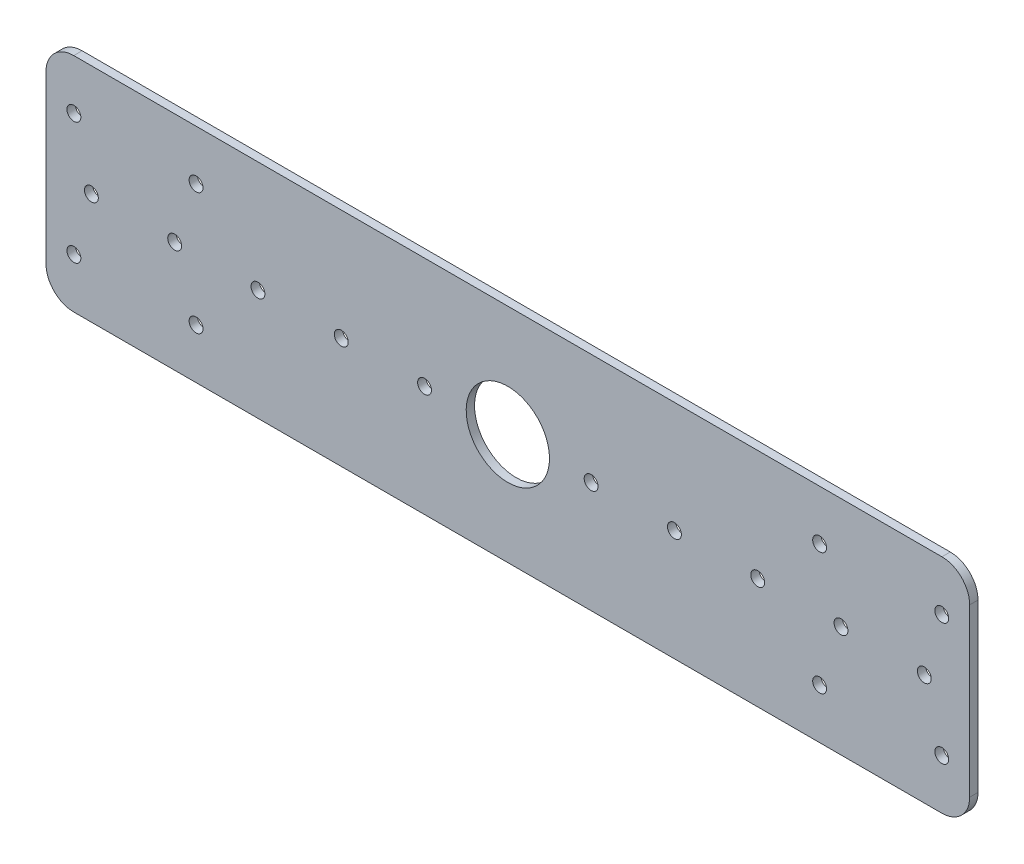
ISO-10303-21;
HEADER;
FILE_DESCRIPTION(('STEP AP214'),'2;1');
FILE_NAME('part.step','',(''),(''),'','','');
FILE_SCHEMA(('AUTOMOTIVE_DESIGN { 1 0 10303 214 1 1 1 1 }'));
ENDSEC;
DATA;
#1=APPLICATION_CONTEXT('core data for automotive mechanical design processes');
#2=APPLICATION_PROTOCOL_DEFINITION('international standard','automotive_design',2000,#1);
#3=PRODUCT_CONTEXT('',#1,'mechanical');
#4=PRODUCT('Part','Part','',(#3));
#5=PRODUCT_RELATED_PRODUCT_CATEGORY('part','',(#4));
#6=PRODUCT_DEFINITION_FORMATION('','',#4);
#7=PRODUCT_DEFINITION_CONTEXT('part definition',#1,'design');
#8=PRODUCT_DEFINITION('design','',#6,#7);
#9=PRODUCT_DEFINITION_SHAPE('','',#8);
#10=(LENGTH_UNIT() NAMED_UNIT(*) SI_UNIT(.MILLI.,.METRE.));
#11=(NAMED_UNIT(*) PLANE_ANGLE_UNIT() SI_UNIT($,.RADIAN.));
#12=(NAMED_UNIT(*) SI_UNIT($,.STERADIAN.) SOLID_ANGLE_UNIT());
#13=UNCERTAINTY_MEASURE_WITH_UNIT(LENGTH_MEASURE(1.E-05),#10,'distance_accuracy_value','');
#14=(GEOMETRIC_REPRESENTATION_CONTEXT(3) GLOBAL_UNCERTAINTY_ASSIGNED_CONTEXT((#13)) GLOBAL_UNIT_ASSIGNED_CONTEXT((#10,
#11,#12)) REPRESENTATION_CONTEXT('',''));
#15=CARTESIAN_POINT('',(0.,0.,0.));
#16=DIRECTION('',(0.,0.,1.));
#17=DIRECTION('',(1.,0.,0.));
#18=AXIS2_PLACEMENT_3D('',#15,#16,#17);
#19=CARTESIAN_POINT('',(83.8429399397533,-104.498537260053,2.9999972895472));
#20=DIRECTION('',(-1.,0.,0.));
#21=DIRECTION('',(0.,0.,1.));
#22=AXIS2_PLACEMENT_3D('',#19,#20,#21);
#23=PLANE('',#22);
#24=DIRECTION('',(0.,1.,2.59377104206923E-08));
#25=VECTOR('',#24,1.);
#26=CARTESIAN_POINT('',(83.8429399397533,-104.498537260053,2.9999972895472));
#27=LINE('',#26,#25);
#28=CARTESIAN_POINT('',(83.8429399397533,-169.998615709826,2.99999559062514));
#29=VERTEX_POINT('',#28);
#30=CARTESIAN_POINT('',(83.8429399397533,-109.998615709826,2.99999714688776));
#31=VERTEX_POINT('',#30);
#32=EDGE_CURVE('E140',#29,#31,#27,.T.);
#33=ORIENTED_EDGE('',*,*,#32,.F.);
#34=DIRECTION('',(0.,-2.59377104206923E-08,1.));
#35=VECTOR('',#34,1.);
#36=CARTESIAN_POINT('',(83.8429399397533,-169.998615632013,-4.40937486285395E-06));
#37=LINE('',#36,#35);
#38=CARTESIAN_POINT('',(83.8429399397533,-169.998615632013,-4.4093748641832E-06));
#39=VERTEX_POINT('',#38);
#40=EDGE_CURVE('E153',#29,#39,#37,.F.);
#41=ORIENTED_EDGE('',*,*,#40,.T.);
#42=DIRECTION('',(0.,1.,2.59377104206923E-08));
#43=VECTOR('',#42,1.);
#44=CARTESIAN_POINT('',(83.8429399397533,-104.49853718224,-2.71045279682035E-06));
#45=LINE('',#44,#43);
#46=CARTESIAN_POINT('',(83.8429399397533,-109.998615632013,-2.85311223894166E-06));
#47=VERTEX_POINT('',#46);
#48=EDGE_CURVE('E172',#39,#47,#45,.T.);
#49=ORIENTED_EDGE('',*,*,#48,.T.);
#50=DIRECTION('',(0.,-2.59377104206923E-08,1.));
#51=VECTOR('',#50,1.);
#52=CARTESIAN_POINT('',(83.8429399397533,-109.998615709826,2.99999714688776));
#53=LINE('',#52,#51);
#54=EDGE_CURVE('E150',#47,#31,#53,.T.);
#55=ORIENTED_EDGE('',*,*,#54,.T.);
#56=EDGE_LOOP('',(#33,#41,#49,#55));
#57=FACE_BOUND('',#56,.T.);
#58=ADVANCED_FACE('F45',(#57),#23,.F.);
#59=CARTESIAN_POINT('',(-248.842939940333,-104.498537260053,2.9999972895472));
#60=DIRECTION('',(1.,0.,0.));
#61=DIRECTION('',(0.,0.,-1.));
#62=AXIS2_PLACEMENT_3D('',#59,#60,#61);
#63=PLANE('',#62);
#64=DIRECTION('',(0.,-1.,-2.59377104206923E-08));
#65=VECTOR('',#64,1.);
#66=CARTESIAN_POINT('',(-248.842939940333,-104.49853718224,-2.7104527968145E-06));
#67=LINE('',#66,#65);
#68=CARTESIAN_POINT('',(-248.842939940333,-109.998615632013,-2.85311223893581E-06));
#69=VERTEX_POINT('',#68);
#70=CARTESIAN_POINT('',(-248.842939940333,-169.998615632013,-4.40937486417735E-06));
#71=VERTEX_POINT('',#70);
#72=EDGE_CURVE('E168',#69,#71,#67,.T.);
#73=ORIENTED_EDGE('',*,*,#72,.T.);
#74=DIRECTION('',(0.,-2.59377104206923E-08,1.));
#75=VECTOR('',#74,1.);
#76=CARTESIAN_POINT('',(-248.842939940333,-169.998615709826,2.99999559062514));
#77=LINE('',#76,#75);
#78=CARTESIAN_POINT('',(-248.842939940333,-169.998615709826,2.99999559062514));
#79=VERTEX_POINT('',#78);
#80=EDGE_CURVE('E11',#71,#79,#77,.T.);
#81=ORIENTED_EDGE('',*,*,#80,.T.);
#82=DIRECTION('',(0.,-1.,-2.59377104206923E-08));
#83=VECTOR('',#82,1.);
#84=CARTESIAN_POINT('',(-248.842939940333,-104.498537260053,2.9999972895472));
#85=LINE('',#84,#83);
#86=CARTESIAN_POINT('',(-248.842939940333,-109.998615709826,2.99999714688776));
#87=VERTEX_POINT('',#86);
#88=EDGE_CURVE('E117',#87,#79,#85,.T.);
#89=ORIENTED_EDGE('',*,*,#88,.F.);
#90=DIRECTION('',(0.,-2.59377104206923E-08,1.));
#91=VECTOR('',#90,1.);
#92=CARTESIAN_POINT('',(-248.842939940333,-109.998615709826,2.99999714688776));
#93=LINE('',#92,#91);
#94=EDGE_CURVE('E53',#87,#69,#93,.F.);
#95=ORIENTED_EDGE('',*,*,#94,.T.);
#96=EDGE_LOOP('',(#73,#81,#89,#95));
#97=FACE_BOUND('',#96,.T.);
#98=ADVANCED_FACE('F167',(#97),#63,.F.);
#99=CARTESIAN_POINT('',(0.,-7.78131312620769E-08,3.));
#100=DIRECTION('',(0.,-2.59377104206923E-08,1.));
#101=DIRECTION('',(0.,-1.,-2.59377104206923E-08));
#102=AXIS2_PLACEMENT_3D('',#99,#100,#101);
#103=PLANE('',#102);
#104=CARTESIAN_POINT('',(-232.50000000029,-139.998615709826,2.99999844377328));
#105=DIRECTION('',(0.,2.59377104206923E-08,-1.));
#106=DIRECTION('',(0.,1.,2.59377104206923E-08));
#107=AXIS2_PLACEMENT_3D('',#104,#105,#106);
#108=CIRCLE('',#107,2.5);
#109=CARTESIAN_POINT('',(-232.50000000029,-137.498615709826,2.99999850861756));
#110=VERTEX_POINT('',#109);
#111=EDGE_CURVE('E366',#110,#110,#108,.T.);
#112=ORIENTED_EDGE('',*,*,#111,.T.);
#113=EDGE_LOOP('',(#112));
#114=FACE_BOUND('',#113,.T.);
#115=CARTESIAN_POINT('',(67.49999999971,-139.998615709826,2.99999844377328));
#116=DIRECTION('',(0.,2.59377104206923E-08,-1.));
#117=DIRECTION('',(0.,1.,2.59377104206923E-08));
#118=AXIS2_PLACEMENT_3D('',#115,#116,#117);
#119=CIRCLE('',#118,2.5);
#120=CARTESIAN_POINT('',(67.49999999971,-137.498615709826,2.99999850861756));
#121=VERTEX_POINT('',#120);
#122=EDGE_CURVE('E370',#121,#121,#119,.T.);
#123=ORIENTED_EDGE('',*,*,#122,.T.);
#124=EDGE_LOOP('',(#123));
#125=FACE_BOUND('',#124,.T.);
#126=CARTESIAN_POINT('',(37.49999999971,-139.998615709826,2.99999844377328));
#127=DIRECTION('',(0.,2.59377104206923E-08,-1.));
#128=DIRECTION('',(0.,1.,2.59377104206923E-08));
#129=AXIS2_PLACEMENT_3D('',#126,#127,#128);
#130=CIRCLE('',#129,2.5);
#131=CARTESIAN_POINT('',(37.49999999971,-137.498615709826,2.99999850861756));
#132=VERTEX_POINT('',#131);
#133=EDGE_CURVE('E374',#132,#132,#130,.T.);
#134=ORIENTED_EDGE('',*,*,#133,.T.);
#135=EDGE_LOOP('',(#134));
#136=FACE_BOUND('',#135,.T.);
#137=CARTESIAN_POINT('',(7.49999999971002,-139.998615709826,2.99999844377328));
#138=DIRECTION('',(0.,2.59377104206923E-08,-1.));
#139=DIRECTION('',(0.,1.,2.59377104206923E-08));
#140=AXIS2_PLACEMENT_3D('',#137,#138,#139);
#141=CIRCLE('',#140,2.5);
#142=CARTESIAN_POINT('',(7.49999999971002,-137.498615709826,2.99999850861756));
#143=VERTEX_POINT('',#142);
#144=EDGE_CURVE('E378',#143,#143,#141,.T.);
#145=ORIENTED_EDGE('',*,*,#144,.T.);
#146=EDGE_LOOP('',(#145));
#147=FACE_BOUND('',#146,.T.);
#148=CARTESIAN_POINT('',(-22.50000000029,-139.998615709826,2.99999844377328));
#149=DIRECTION('',(0.,2.59377104206923E-08,-1.));
#150=DIRECTION('',(0.,1.,2.59377104206923E-08));
#151=AXIS2_PLACEMENT_3D('',#148,#149,#150);
#152=CIRCLE('',#151,2.5);
#153=CARTESIAN_POINT('',(-22.50000000029,-137.498615709826,2.99999850861756));
#154=VERTEX_POINT('',#153);
#155=EDGE_CURVE('E382',#154,#154,#152,.T.);
#156=ORIENTED_EDGE('',*,*,#155,.T.);
#157=EDGE_LOOP('',(#156));
#158=FACE_BOUND('',#157,.T.);
#159=CARTESIAN_POINT('',(-52.50000000029,-139.998615709826,2.99999844377328));
#160=DIRECTION('',(0.,2.59377104206923E-08,-1.));
#161=DIRECTION('',(0.,1.,2.59377104206923E-08));
#162=AXIS2_PLACEMENT_3D('',#159,#160,#161);
#163=CIRCLE('',#162,2.5);
#164=CARTESIAN_POINT('',(-52.50000000029,-137.498615709826,2.99999850861756));
#165=VERTEX_POINT('',#164);
#166=EDGE_CURVE('E386',#165,#165,#163,.T.);
#167=ORIENTED_EDGE('',*,*,#166,.T.);
#168=EDGE_LOOP('',(#167));
#169=FACE_BOUND('',#168,.T.);
#170=CARTESIAN_POINT('',(-112.50000000029,-139.998615709826,2.99999844377328));
#171=DIRECTION('',(0.,2.59377104206923E-08,-1.));
#172=DIRECTION('',(0.,1.,2.59377104206923E-08));
#173=AXIS2_PLACEMENT_3D('',#170,#171,#172);
#174=CIRCLE('',#173,2.5);
#175=CARTESIAN_POINT('',(-112.50000000029,-137.498615709826,2.99999850861756));
#176=VERTEX_POINT('',#175);
#177=EDGE_CURVE('E390',#176,#176,#174,.T.);
#178=ORIENTED_EDGE('',*,*,#177,.T.);
#179=EDGE_LOOP('',(#178));
#180=FACE_BOUND('',#179,.T.);
#181=CARTESIAN_POINT('',(-142.50000000029,-139.998615709826,2.99999844377328));
#182=DIRECTION('',(0.,2.59377104206923E-08,-1.));
#183=DIRECTION('',(0.,1.,2.59377104206923E-08));
#184=AXIS2_PLACEMENT_3D('',#181,#182,#183);
#185=CIRCLE('',#184,2.5);
#186=CARTESIAN_POINT('',(-142.50000000029,-137.498615709826,2.99999850861756));
#187=VERTEX_POINT('',#186);
#188=EDGE_CURVE('E394',#187,#187,#185,.T.);
#189=ORIENTED_EDGE('',*,*,#188,.T.);
#190=EDGE_LOOP('',(#189));
#191=FACE_BOUND('',#190,.T.);
#192=CARTESIAN_POINT('',(-172.50000000029,-139.998615709826,2.99999844377328));
#193=DIRECTION('',(0.,2.59377104206923E-08,-1.));
#194=DIRECTION('',(0.,1.,2.59377104206923E-08));
#195=AXIS2_PLACEMENT_3D('',#192,#193,#194);
#196=CIRCLE('',#195,2.5);
#197=CARTESIAN_POINT('',(-172.50000000029,-137.498615709826,2.99999850861756));
#198=VERTEX_POINT('',#197);
#199=EDGE_CURVE('E398',#198,#198,#196,.T.);
#200=ORIENTED_EDGE('',*,*,#199,.T.);
#201=EDGE_LOOP('',(#200));
#202=FACE_BOUND('',#201,.T.);
#203=CARTESIAN_POINT('',(-202.50000000029,-139.998615709826,2.99999844377328));
#204=DIRECTION('',(0.,2.59377104206923E-08,-1.));
#205=DIRECTION('',(0.,1.,2.59377104206923E-08));
#206=AXIS2_PLACEMENT_3D('',#203,#204,#205);
#207=CIRCLE('',#206,2.5);
#208=CARTESIAN_POINT('',(-202.50000000029,-137.498615709826,2.99999850861756));
#209=VERTEX_POINT('',#208);
#210=EDGE_CURVE('E133',#209,#209,#207,.T.);
#211=ORIENTED_EDGE('',*,*,#210,.T.);
#212=EDGE_LOOP('',(#211));
#213=FACE_BOUND('',#212,.T.);
#214=CARTESIAN_POINT('',(73.7999979399371,-161.998615709887,2.99999579812682));
#215=DIRECTION('',(0.,-2.59377104206923E-08,1.));
#216=DIRECTION('',(0.,-1.,-2.59377104206923E-08));
#217=AXIS2_PLACEMENT_3D('',#214,#215,#216);
#218=CIRCLE('',#217,2.5);
#219=CARTESIAN_POINT('',(73.7999979399371,-164.498615709887,2.99999573328254));
#220=VERTEX_POINT('',#219);
#221=EDGE_CURVE('E228',#220,#220,#218,.T.);
#222=ORIENTED_EDGE('',*,*,#221,.F.);
#223=EDGE_LOOP('',(#222));
#224=FACE_BOUND('',#223,.T.);
#225=CARTESIAN_POINT('',(-238.799997940517,-161.998615709887,2.99999579812682));
#226=DIRECTION('',(0.,-2.59377104206923E-08,1.));
#227=DIRECTION('',(0.,-1.,-2.59377104206923E-08));
#228=AXIS2_PLACEMENT_3D('',#225,#226,#227);
#229=CIRCLE('',#228,2.5);
#230=CARTESIAN_POINT('',(-238.799997940517,-164.498615709887,2.99999573328254));
#231=VERTEX_POINT('',#230);
#232=EDGE_CURVE('E225',#231,#231,#229,.T.);
#233=ORIENTED_EDGE('',*,*,#232,.F.);
#234=EDGE_LOOP('',(#233));
#235=FACE_BOUND('',#234,.T.);
#236=CARTESIAN_POINT('',(-194.799997940493,-161.998615709887,2.99999579812682));
#237=DIRECTION('',(0.,-2.59377104206923E-08,1.));
#238=DIRECTION('',(0.,-1.,-2.59377104206923E-08));
#239=AXIS2_PLACEMENT_3D('',#236,#237,#238);
#240=CIRCLE('',#239,2.5);
#241=CARTESIAN_POINT('',(-194.799997940493,-164.498615709887,2.99999573328254));
#242=VERTEX_POINT('',#241);
#243=EDGE_CURVE('E222',#242,#242,#240,.T.);
#244=ORIENTED_EDGE('',*,*,#243,.F.);
#245=EDGE_LOOP('',(#244));
#246=FACE_BOUND('',#245,.T.);
#247=CARTESIAN_POINT('',(-194.799997940517,-117.998615709887,2.99999693938608));
#248=DIRECTION('',(0.,-2.59377104206923E-08,1.));
#249=DIRECTION('',(0.,-1.,-2.59377104206923E-08));
#250=AXIS2_PLACEMENT_3D('',#247,#248,#249);
#251=CIRCLE('',#250,2.5);
#252=CARTESIAN_POINT('',(-194.799997940517,-120.498615709887,2.9999968745418));
#253=VERTEX_POINT('',#252);
#254=EDGE_CURVE('E219',#253,#253,#251,.T.);
#255=ORIENTED_EDGE('',*,*,#254,.F.);
#256=EDGE_LOOP('',(#255));
#257=FACE_BOUND('',#256,.T.);
#258=CARTESIAN_POINT('',(29.7999979399133,-161.998615709887,2.99999579812682));
#259=DIRECTION('',(0.,-2.59377104206923E-08,1.));
#260=DIRECTION('',(0.,-1.,-2.59377104206923E-08));
#261=AXIS2_PLACEMENT_3D('',#258,#259,#260);
#262=CIRCLE('',#261,2.5);
#263=CARTESIAN_POINT('',(29.7999979399133,-164.498615709887,2.99999573328254));
#264=VERTEX_POINT('',#263);
#265=EDGE_CURVE('E216',#264,#264,#262,.T.);
#266=ORIENTED_EDGE('',*,*,#265,.F.);
#267=EDGE_LOOP('',(#266));
#268=FACE_BOUND('',#267,.T.);
#269=CARTESIAN_POINT('',(29.799997939937,-117.998615709887,2.99999693938608));
#270=DIRECTION('',(0.,-2.59377104206923E-08,1.));
#271=DIRECTION('',(0.,-1.,-2.59377104206923E-08));
#272=AXIS2_PLACEMENT_3D('',#269,#270,#271);
#273=CIRCLE('',#272,2.5);
#274=CARTESIAN_POINT('',(29.799997939937,-120.498615709887,2.9999968745418));
#275=VERTEX_POINT('',#274);
#276=EDGE_CURVE('E213',#275,#275,#273,.T.);
#277=ORIENTED_EDGE('',*,*,#276,.F.);
#278=EDGE_LOOP('',(#277));
#279=FACE_BOUND('',#278,.T.);
#280=CARTESIAN_POINT('',(73.799997939937,-117.998615709911,2.99999693938608));
#281=DIRECTION('',(0.,-2.59377104206923E-08,1.));
#282=DIRECTION('',(0.,-1.,-2.59377104206923E-08));
#283=AXIS2_PLACEMENT_3D('',#280,#281,#282);
#284=CIRCLE('',#283,2.50000000000003);
#285=CARTESIAN_POINT('',(73.799997939937,-120.498615709911,2.9999968745418));
#286=VERTEX_POINT('',#285);
#287=EDGE_CURVE('E210',#286,#286,#284,.T.);
#288=ORIENTED_EDGE('',*,*,#287,.F.);
#289=EDGE_LOOP('',(#288));
#290=FACE_BOUND('',#289,.T.);
#291=CARTESIAN_POINT('',(-238.799997940517,-117.998615709911,2.99999693938608));
#292=DIRECTION('',(0.,-2.59377104206923E-08,1.));
#293=DIRECTION('',(0.,-1.,-2.59377104206923E-08));
#294=AXIS2_PLACEMENT_3D('',#291,#292,#293);
#295=CIRCLE('',#294,2.50000000000002);
#296=CARTESIAN_POINT('',(-238.799997940517,-120.498615709911,2.9999968745418));
#297=VERTEX_POINT('',#296);
#298=EDGE_CURVE('E207',#297,#297,#295,.T.);
#299=ORIENTED_EDGE('',*,*,#298,.F.);
#300=EDGE_LOOP('',(#299));
#301=FACE_BOUND('',#300,.T.);
#302=CARTESIAN_POINT('',(-82.50000000029,-139.998615709826,2.99999636875645));
#303=DIRECTION('',(0.,-2.59377104206923E-08,1.));
#304=DIRECTION('',(0.,-1.,-2.59377104206923E-08));
#305=AXIS2_PLACEMENT_3D('',#302,#303,#304);
#306=CIRCLE('',#305,15.);
#307=CARTESIAN_POINT('',(-82.50000000029,-154.998615709826,2.99999597969079));
#308=VERTEX_POINT('',#307);
#309=EDGE_CURVE('E231',#308,#308,#306,.T.);
#310=ORIENTED_EDGE('',*,*,#309,.F.);
#311=EDGE_LOOP('',(#310));
#312=FACE_BOUND('',#311,.T.);
#313=DIRECTION('',(1.,0.,0.));
#314=VECTOR('',#313,1.);
#315=CARTESIAN_POINT('',(0.,-179.998615709826,2.99999533124803));
#316=LINE('',#315,#314);
#317=CARTESIAN_POINT('',(-238.842939940333,-179.998615709826,2.99999533124803));
#318=VERTEX_POINT('',#317);
#319=CARTESIAN_POINT('',(73.8429399397533,-179.998615709826,2.99999533124803));
#320=VERTEX_POINT('',#319);
#321=EDGE_CURVE('E115',#318,#320,#316,.T.);
#322=ORIENTED_EDGE('',*,*,#321,.T.);
#323=CARTESIAN_POINT('',(73.8429399397533,-169.998615709826,2.99999559062514));
#324=DIRECTION('',(0.,-2.59377104206923E-08,1.));
#325=DIRECTION('',(0.,-1.,-2.59377104206923E-08));
#326=AXIS2_PLACEMENT_3D('',#323,#324,#325);
#327=CIRCLE('',#326,10.);
#328=EDGE_CURVE('E148',#320,#29,#327,.T.);
#329=ORIENTED_EDGE('',*,*,#328,.T.);
#330=ORIENTED_EDGE('',*,*,#32,.T.);
#331=CARTESIAN_POINT('',(73.8429399397533,-109.998615709826,2.99999714688776));
#332=DIRECTION('',(0.,-2.59377104206923E-08,1.));
#333=DIRECTION('',(0.,-1.,-2.59377104206923E-08));
#334=AXIS2_PLACEMENT_3D('',#331,#332,#333);
#335=CIRCLE('',#334,10.);
#336=CARTESIAN_POINT('',(73.8429399397533,-99.998615709826,2.99999740626487));
#337=VERTEX_POINT('',#336);
#338=EDGE_CURVE('E121',#31,#337,#335,.T.);
#339=ORIENTED_EDGE('',*,*,#338,.T.);
#340=DIRECTION('',(1.,0.,0.));
#341=VECTOR('',#340,1.);
#342=CARTESIAN_POINT('',(0.,-99.998615709826,2.99999740626487));
#343=LINE('',#342,#341);
#344=CARTESIAN_POINT('',(-238.842939940333,-99.998615709826,2.99999740626487));
#345=VERTEX_POINT('',#344);
#346=EDGE_CURVE('E176',#345,#337,#343,.T.);
#347=ORIENTED_EDGE('',*,*,#346,.F.);
#348=CARTESIAN_POINT('',(-238.842939940333,-109.998615709826,2.99999714688776));
#349=DIRECTION('',(0.,-2.59377104206923E-08,1.));
#350=DIRECTION('',(0.,-1.,-2.59377104206923E-08));
#351=AXIS2_PLACEMENT_3D('',#348,#349,#350);
#352=CIRCLE('',#351,10.);
#353=EDGE_CURVE('E122',#345,#87,#352,.T.);
#354=ORIENTED_EDGE('',*,*,#353,.T.);
#355=ORIENTED_EDGE('',*,*,#88,.T.);
#356=CARTESIAN_POINT('',(-238.842939940333,-169.998615709826,2.99999559062513));
#357=DIRECTION('',(0.,-2.59377104206923E-08,1.));
#358=DIRECTION('',(0.,-1.,-2.59377104206923E-08));
#359=AXIS2_PLACEMENT_3D('',#356,#357,#358);
#360=CIRCLE('',#359,10.);
#361=EDGE_CURVE('E112',#79,#318,#360,.T.);
#362=ORIENTED_EDGE('',*,*,#361,.T.);
#363=EDGE_LOOP('',(#322,#329,#330,#339,#347,#354,#355,#362));
#364=FACE_BOUND('',#363,.T.);
#365=ADVANCED_FACE('F114',(#114,#125,#136,#147,#158,#169,#180,#191,#202,#213,#224,#235,#246,
#257,#268,#279,#290,#301,#312,#364),#103,.T.);
#366=CARTESIAN_POINT('',(0.,0.,0.));
#367=DIRECTION('',(0.,-2.59377104206923E-08,1.));
#368=DIRECTION('',(0.,-1.,-2.59377104206923E-08));
#369=AXIS2_PLACEMENT_3D('',#366,#367,#368);
#370=PLANE('',#369);
#371=CARTESIAN_POINT('',(-232.50000000029,-139.998615632013,-3.63124355155687E-06));
#372=DIRECTION('',(0.,2.59377104206923E-08,-1.));
#373=DIRECTION('',(0.,1.,2.59377104206923E-08));
#374=AXIS2_PLACEMENT_3D('',#371,#372,#373);
#375=CIRCLE('',#374,2.5);
#376=CARTESIAN_POINT('',(-232.50000000029,-137.498615632013,-3.56639927550514E-06));
#377=VERTEX_POINT('',#376);
#378=EDGE_CURVE('E417',#377,#377,#375,.T.);
#379=ORIENTED_EDGE('',*,*,#378,.F.);
#380=EDGE_LOOP('',(#379));
#381=FACE_BOUND('',#380,.T.);
#382=CARTESIAN_POINT('',(67.49999999971,-139.998615632013,-3.6312435515618E-06));
#383=DIRECTION('',(0.,2.59377104206923E-08,-1.));
#384=DIRECTION('',(0.,1.,2.59377104206923E-08));
#385=AXIS2_PLACEMENT_3D('',#382,#383,#384);
#386=CIRCLE('',#385,2.5);
#387=CARTESIAN_POINT('',(67.49999999971,-137.498615632013,-3.56639927551007E-06));
#388=VERTEX_POINT('',#387);
#389=EDGE_CURVE('E421',#388,#388,#386,.T.);
#390=ORIENTED_EDGE('',*,*,#389,.F.);
#391=EDGE_LOOP('',(#390));
#392=FACE_BOUND('',#391,.T.);
#393=CARTESIAN_POINT('',(37.49999999971,-139.998615632013,-3.6312435515618E-06));
#394=DIRECTION('',(0.,2.59377104206923E-08,-1.));
#395=DIRECTION('',(0.,1.,2.59377104206923E-08));
#396=AXIS2_PLACEMENT_3D('',#393,#394,#395);
#397=CIRCLE('',#396,2.5);
#398=CARTESIAN_POINT('',(37.49999999971,-137.498615632013,-3.56639927551007E-06));
#399=VERTEX_POINT('',#398);
#400=EDGE_CURVE('E425',#399,#399,#397,.T.);
#401=ORIENTED_EDGE('',*,*,#400,.F.);
#402=EDGE_LOOP('',(#401));
#403=FACE_BOUND('',#402,.T.);
#404=CARTESIAN_POINT('',(7.49999999971002,-139.998615632013,-3.6312435515618E-06));
#405=DIRECTION('',(0.,2.59377104206923E-08,-1.));
#406=DIRECTION('',(0.,1.,2.59377104206923E-08));
#407=AXIS2_PLACEMENT_3D('',#404,#405,#406);
#408=CIRCLE('',#407,2.5);
#409=CARTESIAN_POINT('',(7.49999999971002,-137.498615632013,-3.56639927551007E-06));
#410=VERTEX_POINT('',#409);
#411=EDGE_CURVE('E429',#410,#410,#408,.T.);
#412=ORIENTED_EDGE('',*,*,#411,.F.);
#413=EDGE_LOOP('',(#412));
#414=FACE_BOUND('',#413,.T.);
#415=CARTESIAN_POINT('',(-22.50000000029,-139.998615632013,-3.63124355156011E-06));
#416=DIRECTION('',(0.,2.59377104206923E-08,-1.));
#417=DIRECTION('',(0.,1.,2.59377104206923E-08));
#418=AXIS2_PLACEMENT_3D('',#415,#416,#417);
#419=CIRCLE('',#418,2.5);
#420=CARTESIAN_POINT('',(-22.50000000029,-137.498615632013,-3.56639927550838E-06));
#421=VERTEX_POINT('',#420);
#422=EDGE_CURVE('E433',#421,#421,#419,.T.);
#423=ORIENTED_EDGE('',*,*,#422,.F.);
#424=EDGE_LOOP('',(#423));
#425=FACE_BOUND('',#424,.T.);
#426=CARTESIAN_POINT('',(-52.50000000029,-139.998615632013,-3.63124355156011E-06));
#427=DIRECTION('',(0.,2.59377104206923E-08,-1.));
#428=DIRECTION('',(0.,1.,2.59377104206923E-08));
#429=AXIS2_PLACEMENT_3D('',#426,#427,#428);
#430=CIRCLE('',#429,2.5);
#431=CARTESIAN_POINT('',(-52.50000000029,-137.498615632013,-3.56639927550838E-06));
#432=VERTEX_POINT('',#431);
#433=EDGE_CURVE('E437',#432,#432,#430,.T.);
#434=ORIENTED_EDGE('',*,*,#433,.F.);
#435=EDGE_LOOP('',(#434));
#436=FACE_BOUND('',#435,.T.);
#437=CARTESIAN_POINT('',(-112.50000000029,-139.998615632013,-3.63124355155842E-06));
#438=DIRECTION('',(0.,2.59377104206923E-08,-1.));
#439=DIRECTION('',(0.,1.,2.59377104206923E-08));
#440=AXIS2_PLACEMENT_3D('',#437,#438,#439);
#441=CIRCLE('',#440,2.5);
#442=CARTESIAN_POINT('',(-112.50000000029,-137.498615632013,-3.56639927550669E-06));
#443=VERTEX_POINT('',#442);
#444=EDGE_CURVE('E441',#443,#443,#441,.T.);
#445=ORIENTED_EDGE('',*,*,#444,.F.);
#446=EDGE_LOOP('',(#445));
#447=FACE_BOUND('',#446,.T.);
#448=CARTESIAN_POINT('',(-142.50000000029,-139.998615632013,-3.63124355155842E-06));
#449=DIRECTION('',(0.,2.59377104206923E-08,-1.));
#450=DIRECTION('',(0.,1.,2.59377104206923E-08));
#451=AXIS2_PLACEMENT_3D('',#448,#449,#450);
#452=CIRCLE('',#451,2.5);
#453=CARTESIAN_POINT('',(-142.50000000029,-137.498615632013,-3.56639927550669E-06));
#454=VERTEX_POINT('',#453);
#455=EDGE_CURVE('E445',#454,#454,#452,.T.);
#456=ORIENTED_EDGE('',*,*,#455,.F.);
#457=EDGE_LOOP('',(#456));
#458=FACE_BOUND('',#457,.T.);
#459=CARTESIAN_POINT('',(-172.50000000029,-139.998615632013,-3.63124355155842E-06));
#460=DIRECTION('',(0.,2.59377104206923E-08,-1.));
#461=DIRECTION('',(0.,1.,2.59377104206923E-08));
#462=AXIS2_PLACEMENT_3D('',#459,#460,#461);
#463=CIRCLE('',#462,2.5);
#464=CARTESIAN_POINT('',(-172.50000000029,-137.498615632013,-3.56639927550669E-06));
#465=VERTEX_POINT('',#464);
#466=EDGE_CURVE('E413',#465,#465,#463,.T.);
#467=ORIENTED_EDGE('',*,*,#466,.F.);
#468=EDGE_LOOP('',(#467));
#469=FACE_BOUND('',#468,.T.);
#470=CARTESIAN_POINT('',(-202.50000000029,-139.998615632013,-3.63124355155672E-06));
#471=DIRECTION('',(0.,2.59377104206923E-08,-1.));
#472=DIRECTION('',(0.,1.,2.59377104206923E-08));
#473=AXIS2_PLACEMENT_3D('',#470,#471,#472);
#474=CIRCLE('',#473,2.5);
#475=CARTESIAN_POINT('',(-202.50000000029,-137.498615632013,-3.56639927550499E-06));
#476=VERTEX_POINT('',#475);
#477=EDGE_CURVE('E410',#476,#476,#474,.T.);
#478=ORIENTED_EDGE('',*,*,#477,.F.);
#479=EDGE_LOOP('',(#478));
#480=FACE_BOUND('',#479,.T.);
#481=CARTESIAN_POINT('',(73.7999979399371,-161.998615632074,-4.20187318081906E-06));
#482=DIRECTION('',(0.,2.59377104206923E-08,-1.));
#483=DIRECTION('',(0.,-1.,-2.59377104206923E-08));
#484=AXIS2_PLACEMENT_3D('',#481,#482,#483);
#485=CIRCLE('',#484,2.5);
#486=CARTESIAN_POINT('',(73.7999979399371,-164.498615632074,-4.26671745687079E-06));
#487=VERTEX_POINT('',#486);
#488=EDGE_CURVE('E187',#487,#487,#485,.T.);
#489=ORIENTED_EDGE('',*,*,#488,.F.);
#490=EDGE_LOOP('',(#489));
#491=FACE_BOUND('',#490,.T.);
#492=CARTESIAN_POINT('',(-238.799997940517,-161.998615632074,-4.20187318081357E-06));
#493=DIRECTION('',(0.,2.59377104206923E-08,-1.));
#494=DIRECTION('',(0.,1.,2.59377104206923E-08));
#495=AXIS2_PLACEMENT_3D('',#492,#493,#494);
#496=CIRCLE('',#495,2.5);
#497=CARTESIAN_POINT('',(-238.799997940517,-159.498615632074,-4.13702890476184E-06));
#498=VERTEX_POINT('',#497);
#499=EDGE_CURVE('E193',#498,#498,#496,.T.);
#500=ORIENTED_EDGE('',*,*,#499,.F.);
#501=EDGE_LOOP('',(#500));
#502=FACE_BOUND('',#501,.T.);
#503=CARTESIAN_POINT('',(-194.799997940493,-161.998615632074,-4.20187318081434E-06));
#504=DIRECTION('',(0.,2.59377104206923E-08,-1.));
#505=DIRECTION('',(0.,1.,2.59377104206923E-08));
#506=AXIS2_PLACEMENT_3D('',#503,#504,#505);
#507=CIRCLE('',#506,2.5);
#508=CARTESIAN_POINT('',(-194.799997940493,-159.498615632074,-4.13702890476261E-06));
#509=VERTEX_POINT('',#508);
#510=EDGE_CURVE('E196',#509,#509,#507,.T.);
#511=ORIENTED_EDGE('',*,*,#510,.F.);
#512=EDGE_LOOP('',(#511));
#513=FACE_BOUND('',#512,.T.);
#514=CARTESIAN_POINT('',(-194.799997940517,-117.998615632074,-3.06061392230388E-06));
#515=DIRECTION('',(0.,2.59377104206923E-08,-1.));
#516=DIRECTION('',(0.,1.,2.59377104206923E-08));
#517=AXIS2_PLACEMENT_3D('',#514,#515,#516);
#518=CIRCLE('',#517,2.5);
#519=CARTESIAN_POINT('',(-194.799997940517,-115.498615632074,-2.99576964625215E-06));
#520=VERTEX_POINT('',#519);
#521=EDGE_CURVE('E199',#520,#520,#518,.T.);
#522=ORIENTED_EDGE('',*,*,#521,.F.);
#523=EDGE_LOOP('',(#522));
#524=FACE_BOUND('',#523,.T.);
#525=CARTESIAN_POINT('',(29.7999979399133,-161.998615632074,-4.20187318081829E-06));
#526=DIRECTION('',(0.,2.59377104206923E-08,-1.));
#527=DIRECTION('',(0.,-1.,-2.59377104206923E-08));
#528=AXIS2_PLACEMENT_3D('',#525,#526,#527);
#529=CIRCLE('',#528,2.5);
#530=CARTESIAN_POINT('',(29.7999979399133,-164.498615632074,-4.26671745687002E-06));
#531=VERTEX_POINT('',#530);
#532=EDGE_CURVE('E184',#531,#531,#529,.T.);
#533=ORIENTED_EDGE('',*,*,#532,.F.);
#534=EDGE_LOOP('',(#533));
#535=FACE_BOUND('',#534,.T.);
#536=CARTESIAN_POINT('',(29.799997939937,-117.998615632074,-3.06061392230783E-06));
#537=DIRECTION('',(0.,2.59377104206923E-08,-1.));
#538=DIRECTION('',(0.,-1.,-2.59377104206923E-08));
#539=AXIS2_PLACEMENT_3D('',#536,#537,#538);
#540=CIRCLE('',#539,2.5);
#541=CARTESIAN_POINT('',(29.799997939937,-120.498615632074,-3.12545819835956E-06));
#542=VERTEX_POINT('',#541);
#543=EDGE_CURVE('E188',#542,#542,#540,.T.);
#544=ORIENTED_EDGE('',*,*,#543,.F.);
#545=EDGE_LOOP('',(#544));
#546=FACE_BOUND('',#545,.T.);
#547=CARTESIAN_POINT('',(73.799997939937,-117.998615632097,-3.06061392230922E-06));
#548=DIRECTION('',(0.,2.59377104206923E-08,-1.));
#549=DIRECTION('',(0.,-1.,-2.59377104206923E-08));
#550=AXIS2_PLACEMENT_3D('',#547,#548,#549);
#551=CIRCLE('',#550,2.50000000000003);
#552=CARTESIAN_POINT('',(73.799997939937,-120.498615632097,-3.12545819836095E-06));
#553=VERTEX_POINT('',#552);
#554=EDGE_CURVE('E180',#553,#553,#551,.T.);
#555=ORIENTED_EDGE('',*,*,#554,.F.);
#556=EDGE_LOOP('',(#555));
#557=FACE_BOUND('',#556,.T.);
#558=CARTESIAN_POINT('',(-238.799997940517,-117.998615632098,-3.06061392230373E-06));
#559=DIRECTION('',(0.,2.59377104206923E-08,-1.));
#560=DIRECTION('',(0.,1.,2.59377104206923E-08));
#561=AXIS2_PLACEMENT_3D('',#558,#559,#560);
#562=CIRCLE('',#561,2.50000000000002);
#563=CARTESIAN_POINT('',(-238.799997940517,-115.498615632098,-2.995769646252E-06));
#564=VERTEX_POINT('',#563);
#565=EDGE_CURVE('E202',#564,#564,#562,.T.);
#566=ORIENTED_EDGE('',*,*,#565,.F.);
#567=EDGE_LOOP('',(#566));
#568=FACE_BOUND('',#567,.T.);
#569=CARTESIAN_POINT('',(-82.50000000029,-139.998615632013,-3.63124355237665E-06));
#570=DIRECTION('',(0.,-2.59377104206923E-08,1.));
#571=DIRECTION('',(0.,-1.,-2.59377104206923E-08));
#572=AXIS2_PLACEMENT_3D('',#569,#570,#571);
#573=CIRCLE('',#572,15.);
#574=CARTESIAN_POINT('',(-82.50000000029,-154.998615632013,-4.02030920868704E-06));
#575=VERTEX_POINT('',#574);
#576=EDGE_CURVE('E143',#575,#575,#573,.T.);
#577=ORIENTED_EDGE('',*,*,#576,.T.);
#578=EDGE_LOOP('',(#577));
#579=FACE_BOUND('',#578,.T.);
#580=ORIENTED_EDGE('',*,*,#48,.F.);
#581=CARTESIAN_POINT('',(73.8429399397533,-169.998615632013,-4.40937486418303E-06));
#582=DIRECTION('',(0.,-2.59377104206923E-08,1.));
#583=DIRECTION('',(0.,-1.,-2.59377104206923E-08));
#584=AXIS2_PLACEMENT_3D('',#581,#582,#583);
#585=CIRCLE('',#584,10.);
#586=CARTESIAN_POINT('',(73.8429399397533,-179.998615632013,-4.66875196706087E-06));
#587=VERTEX_POINT('',#586);
#588=EDGE_CURVE('E159',#39,#587,#585,.F.);
#589=ORIENTED_EDGE('',*,*,#588,.T.);
#590=DIRECTION('',(1.,0.,0.));
#591=VECTOR('',#590,1.);
#592=CARTESIAN_POINT('',(0.,-179.998615632013,-4.66875196706087E-06));
#593=LINE('',#592,#591);
#594=CARTESIAN_POINT('',(-238.842939940333,-179.998615632013,-4.66875196706087E-06));
#595=VERTEX_POINT('',#594);
#596=EDGE_CURVE('E132',#595,#587,#593,.T.);
#597=ORIENTED_EDGE('',*,*,#596,.F.);
#598=CARTESIAN_POINT('',(-238.842939940333,-169.998615632013,-4.4093748643656E-06));
#599=DIRECTION('',(0.,-2.59377104206923E-08,1.));
#600=DIRECTION('',(0.,-1.,-2.59377104206923E-08));
#601=AXIS2_PLACEMENT_3D('',#598,#599,#600);
#602=CIRCLE('',#601,10.);
#603=EDGE_CURVE('E137',#595,#71,#602,.F.);
#604=ORIENTED_EDGE('',*,*,#603,.T.);
#605=ORIENTED_EDGE('',*,*,#72,.F.);
#606=CARTESIAN_POINT('',(-238.842939940333,-109.998615632013,-2.85311223893599E-06));
#607=DIRECTION('',(0.,-2.59377104206923E-08,1.));
#608=DIRECTION('',(0.,-1.,-2.59377104206923E-08));
#609=AXIS2_PLACEMENT_3D('',#606,#607,#608);
#610=CIRCLE('',#609,10.);
#611=CARTESIAN_POINT('',(-238.842939940333,-99.9986156320129,-2.59373513335562E-06));
#612=VERTEX_POINT('',#611);
#613=EDGE_CURVE('E67',#69,#612,#610,.F.);
#614=ORIENTED_EDGE('',*,*,#613,.T.);
#615=DIRECTION('',(1.,0.,0.));
#616=VECTOR('',#615,1.);
#617=CARTESIAN_POINT('',(0.,-99.9986156320129,-2.59373513335562E-06));
#618=LINE('',#617,#616);
#619=CARTESIAN_POINT('',(73.8429399397533,-99.9986156320129,-2.59373513335562E-06));
#620=VERTEX_POINT('',#619);
#621=EDGE_CURVE('E177',#612,#620,#618,.T.);
#622=ORIENTED_EDGE('',*,*,#621,.T.);
#623=CARTESIAN_POINT('',(73.8429399397533,-109.998615632013,-2.85311223908666E-06));
#624=DIRECTION('',(0.,-2.59377104206923E-08,1.));
#625=DIRECTION('',(0.,-1.,-2.59377104206923E-08));
#626=AXIS2_PLACEMENT_3D('',#623,#624,#625);
#627=CIRCLE('',#626,10.);
#628=EDGE_CURVE('E157',#620,#47,#627,.F.);
#629=ORIENTED_EDGE('',*,*,#628,.T.);
#630=EDGE_LOOP('',(#580,#589,#597,#604,#605,#614,#622,#629));
#631=FACE_BOUND('',#630,.T.);
#632=ADVANCED_FACE('F171',(#381,#392,#403,#414,#425,#436,#447,#458,#469,#480,#491,#502,#513,
#524,#535,#546,#557,#568,#579,#631),#370,.F.);
#633=CARTESIAN_POINT('',(-82.50000000029,-139.998615450449,-7.00000363124355));
#634=DIRECTION('',(0.,-2.59377104206923E-08,1.));
#635=DIRECTION('',(0.,-1.,-2.59377104206923E-08));
#636=AXIS2_PLACEMENT_3D('',#633,#634,#635);
#637=CYLINDRICAL_SURFACE('',#636,15.);
#638=ORIENTED_EDGE('',*,*,#309,.T.);
#639=EDGE_LOOP('',(#638));
#640=FACE_BOUND('',#639,.T.);
#641=ORIENTED_EDGE('',*,*,#576,.F.);
#642=EDGE_LOOP('',(#641));
#643=FACE_BOUND('',#642,.T.);
#644=ADVANCED_FACE('F242',(#640,#643),#637,.F.);
#645=CARTESIAN_POINT('',(-238.799997940517,-117.998615891475,9.99999693938608));
#646=DIRECTION('',(0.,2.59377104206923E-08,-1.));
#647=DIRECTION('',(0.,1.,2.59377104206923E-08));
#648=AXIS2_PLACEMENT_3D('',#645,#646,#647);
#649=CYLINDRICAL_SURFACE('',#648,2.50000000000002);
#650=ORIENTED_EDGE('',*,*,#298,.T.);
#651=EDGE_LOOP('',(#650));
#652=FACE_BOUND('',#651,.T.);
#653=ORIENTED_EDGE('',*,*,#565,.T.);
#654=EDGE_LOOP('',(#653));
#655=FACE_BOUND('',#654,.T.);
#656=ADVANCED_FACE('F244',(#652,#655),#649,.F.);
#657=CARTESIAN_POINT('',(73.799997939937,-117.998615891475,9.99999693938608));
#658=DIRECTION('',(0.,2.59377104206923E-08,-1.));
#659=DIRECTION('',(0.,1.,2.59377104206923E-08));
#660=AXIS2_PLACEMENT_3D('',#657,#658,#659);
#661=CYLINDRICAL_SURFACE('',#660,2.50000000000003);
#662=ORIENTED_EDGE('',*,*,#287,.T.);
#663=EDGE_LOOP('',(#662));
#664=FACE_BOUND('',#663,.T.);
#665=ORIENTED_EDGE('',*,*,#554,.T.);
#666=EDGE_LOOP('',(#665));
#667=FACE_BOUND('',#666,.T.);
#668=ADVANCED_FACE('F251',(#664,#667),#661,.F.);
#669=CARTESIAN_POINT('',(29.799997939937,-117.998615891451,9.99999693938608));
#670=DIRECTION('',(0.,2.59377104206923E-08,-1.));
#671=DIRECTION('',(0.,1.,2.59377104206923E-08));
#672=AXIS2_PLACEMENT_3D('',#669,#670,#671);
#673=CYLINDRICAL_SURFACE('',#672,2.5);
#674=ORIENTED_EDGE('',*,*,#276,.T.);
#675=EDGE_LOOP('',(#674));
#676=FACE_BOUND('',#675,.T.);
#677=ORIENTED_EDGE('',*,*,#543,.T.);
#678=EDGE_LOOP('',(#677));
#679=FACE_BOUND('',#678,.T.);
#680=ADVANCED_FACE('F304',(#676,#679),#673,.F.);
#681=CARTESIAN_POINT('',(29.7999979399133,-161.998615891451,9.99999579812682));
#682=DIRECTION('',(0.,2.59377104206923E-08,-1.));
#683=DIRECTION('',(0.,1.,2.59377104206923E-08));
#684=AXIS2_PLACEMENT_3D('',#681,#682,#683);
#685=CYLINDRICAL_SURFACE('',#684,2.5);
#686=ORIENTED_EDGE('',*,*,#265,.T.);
#687=EDGE_LOOP('',(#686));
#688=FACE_BOUND('',#687,.T.);
#689=ORIENTED_EDGE('',*,*,#532,.T.);
#690=EDGE_LOOP('',(#689));
#691=FACE_BOUND('',#690,.T.);
#692=ADVANCED_FACE('F300',(#688,#691),#685,.F.);
#693=CARTESIAN_POINT('',(-194.799997940517,-117.998615891451,9.99999693938608));
#694=DIRECTION('',(0.,2.59377104206923E-08,-1.));
#695=DIRECTION('',(0.,1.,2.59377104206923E-08));
#696=AXIS2_PLACEMENT_3D('',#693,#694,#695);
#697=CYLINDRICAL_SURFACE('',#696,2.5);
#698=ORIENTED_EDGE('',*,*,#254,.T.);
#699=EDGE_LOOP('',(#698));
#700=FACE_BOUND('',#699,.T.);
#701=ORIENTED_EDGE('',*,*,#521,.T.);
#702=EDGE_LOOP('',(#701));
#703=FACE_BOUND('',#702,.T.);
#704=ADVANCED_FACE('F303',(#700,#703),#697,.F.);
#705=CARTESIAN_POINT('',(-194.799997940493,-161.998615891451,9.99999579812682));
#706=DIRECTION('',(0.,2.59377104206923E-08,-1.));
#707=DIRECTION('',(0.,1.,2.59377104206923E-08));
#708=AXIS2_PLACEMENT_3D('',#705,#706,#707);
#709=CYLINDRICAL_SURFACE('',#708,2.5);
#710=ORIENTED_EDGE('',*,*,#243,.T.);
#711=EDGE_LOOP('',(#710));
#712=FACE_BOUND('',#711,.T.);
#713=ORIENTED_EDGE('',*,*,#510,.T.);
#714=EDGE_LOOP('',(#713));
#715=FACE_BOUND('',#714,.T.);
#716=ADVANCED_FACE('F315',(#712,#715),#709,.F.);
#717=CARTESIAN_POINT('',(-238.799997940517,-161.998615891451,9.99999579812682));
#718=DIRECTION('',(0.,2.59377104206923E-08,-1.));
#719=DIRECTION('',(0.,1.,2.59377104206923E-08));
#720=AXIS2_PLACEMENT_3D('',#717,#718,#719);
#721=CYLINDRICAL_SURFACE('',#720,2.5);
#722=ORIENTED_EDGE('',*,*,#232,.T.);
#723=EDGE_LOOP('',(#722));
#724=FACE_BOUND('',#723,.T.);
#725=ORIENTED_EDGE('',*,*,#499,.T.);
#726=EDGE_LOOP('',(#725));
#727=FACE_BOUND('',#726,.T.);
#728=ADVANCED_FACE('F312',(#724,#727),#721,.F.);
#729=CARTESIAN_POINT('',(73.7999979399371,-161.998615891451,9.99999579812682));
#730=DIRECTION('',(0.,2.59377104206923E-08,-1.));
#731=DIRECTION('',(0.,1.,2.59377104206923E-08));
#732=AXIS2_PLACEMENT_3D('',#729,#730,#731);
#733=CYLINDRICAL_SURFACE('',#732,2.5);
#734=ORIENTED_EDGE('',*,*,#221,.T.);
#735=EDGE_LOOP('',(#734));
#736=FACE_BOUND('',#735,.T.);
#737=ORIENTED_EDGE('',*,*,#488,.T.);
#738=EDGE_LOOP('',(#737));
#739=FACE_BOUND('',#738,.T.);
#740=ADVANCED_FACE('F299',(#736,#739),#733,.F.);
#741=CARTESIAN_POINT('',(0.,-99.9986156320129,-2.59373513335562E-06));
#742=DIRECTION('',(0.,-1.,-2.59377104206923E-08));
#743=DIRECTION('',(0.,2.59377104206923E-08,-1.));
#744=AXIS2_PLACEMENT_3D('',#741,#742,#743);
#745=PLANE('',#744);
#746=ORIENTED_EDGE('',*,*,#346,.T.);
#747=DIRECTION('',(0.,-2.59377104206923E-08,1.));
#748=VECTOR('',#747,1.);
#749=CARTESIAN_POINT('',(73.8429399397533,-99.9986156320129,-2.59373513335692E-06));
#750=LINE('',#749,#748);
#751=EDGE_CURVE('E60',#337,#620,#750,.F.);
#752=ORIENTED_EDGE('',*,*,#751,.T.);
#753=ORIENTED_EDGE('',*,*,#621,.F.);
#754=DIRECTION('',(0.,-2.59377104206923E-08,1.));
#755=VECTOR('',#754,1.);
#756=CARTESIAN_POINT('',(-238.842939940333,-99.9986156320129,-2.59373513335142E-06));
#757=LINE('',#756,#755);
#758=EDGE_CURVE('E161',#612,#345,#757,.T.);
#759=ORIENTED_EDGE('',*,*,#758,.T.);
#760=EDGE_LOOP('',(#746,#752,#753,#759));
#761=FACE_BOUND('',#760,.T.);
#762=ADVANCED_FACE('F175',(#761),#745,.F.);
#763=CARTESIAN_POINT('',(0.,-179.998615632013,-4.66875196706087E-06));
#764=DIRECTION('',(0.,-1.,-2.59377104206923E-08));
#765=DIRECTION('',(0.,2.59377104206923E-08,-1.));
#766=AXIS2_PLACEMENT_3D('',#763,#764,#765);
#767=PLANE('',#766);
#768=ORIENTED_EDGE('',*,*,#596,.T.);
#769=DIRECTION('',(0.,-2.59377104206923E-08,1.));
#770=VECTOR('',#769,1.);
#771=CARTESIAN_POINT('',(73.8429399397533,-179.998615709826,2.99999533124803));
#772=LINE('',#771,#770);
#773=EDGE_CURVE('E131',#587,#320,#772,.T.);
#774=ORIENTED_EDGE('',*,*,#773,.T.);
#775=ORIENTED_EDGE('',*,*,#321,.F.);
#776=DIRECTION('',(0.,-2.59377104206923E-08,1.));
#777=VECTOR('',#776,1.);
#778=CARTESIAN_POINT('',(-238.842939940333,-179.998615632013,-4.66875196727148E-06));
#779=LINE('',#778,#777);
#780=EDGE_CURVE('E128',#318,#595,#779,.F.);
#781=ORIENTED_EDGE('',*,*,#780,.T.);
#782=EDGE_LOOP('',(#768,#774,#775,#781));
#783=FACE_BOUND('',#782,.T.);
#784=ADVANCED_FACE('F127',(#783),#767,.T.);
#785=CARTESIAN_POINT('',(73.8429399397533,-169.998615632013,-4.40937486285525E-06));
#786=DIRECTION('',(0.,2.59377104206923E-08,-1.));
#787=DIRECTION('',(0.,1.,2.59377104206923E-08));
#788=AXIS2_PLACEMENT_3D('',#785,#786,#787);
#789=CYLINDRICAL_SURFACE('',#788,10.);
#790=ORIENTED_EDGE('',*,*,#588,.F.);
#791=ORIENTED_EDGE('',*,*,#40,.F.);
#792=ORIENTED_EDGE('',*,*,#328,.F.);
#793=ORIENTED_EDGE('',*,*,#773,.F.);
#794=EDGE_LOOP('',(#790,#791,#792,#793));
#795=FACE_BOUND('',#794,.T.);
#796=ADVANCED_FACE('F265',(#795),#789,.T.);
#797=CARTESIAN_POINT('',(73.8429399397533,-109.998615709826,2.99999714688776));
#798=DIRECTION('',(0.,-2.59377104206923E-08,1.));
#799=DIRECTION('',(0.,-1.,-2.59377104206923E-08));
#800=AXIS2_PLACEMENT_3D('',#797,#798,#799);
#801=CYLINDRICAL_SURFACE('',#800,10.);
#802=ORIENTED_EDGE('',*,*,#628,.F.);
#803=ORIENTED_EDGE('',*,*,#751,.F.);
#804=ORIENTED_EDGE('',*,*,#338,.F.);
#805=ORIENTED_EDGE('',*,*,#54,.F.);
#806=EDGE_LOOP('',(#802,#803,#804,#805));
#807=FACE_BOUND('',#806,.T.);
#808=ADVANCED_FACE('F268',(#807),#801,.T.);
#809=CARTESIAN_POINT('',(-238.842939940333,-169.998615709826,2.99999559062514));
#810=DIRECTION('',(0.,2.59377104206923E-08,-1.));
#811=DIRECTION('',(0.,1.,2.59377104206923E-08));
#812=AXIS2_PLACEMENT_3D('',#809,#810,#811);
#813=CYLINDRICAL_SURFACE('',#812,10.);
#814=ORIENTED_EDGE('',*,*,#603,.F.);
#815=ORIENTED_EDGE('',*,*,#780,.F.);
#816=ORIENTED_EDGE('',*,*,#361,.F.);
#817=ORIENTED_EDGE('',*,*,#80,.F.);
#818=EDGE_LOOP('',(#814,#815,#816,#817));
#819=FACE_BOUND('',#818,.T.);
#820=ADVANCED_FACE('F136',(#819),#813,.T.);
#821=CARTESIAN_POINT('',(-238.842939940333,-109.998615632013,-2.85311223755834E-06));
#822=DIRECTION('',(0.,-2.59377104206923E-08,1.));
#823=DIRECTION('',(0.,-1.,-2.59377104206923E-08));
#824=AXIS2_PLACEMENT_3D('',#821,#822,#823);
#825=CYLINDRICAL_SURFACE('',#824,10.);
#826=ORIENTED_EDGE('',*,*,#613,.F.);
#827=ORIENTED_EDGE('',*,*,#94,.F.);
#828=ORIENTED_EDGE('',*,*,#353,.F.);
#829=ORIENTED_EDGE('',*,*,#758,.F.);
#830=EDGE_LOOP('',(#826,#827,#828,#829));
#831=FACE_BOUND('',#830,.T.);
#832=ADVANCED_FACE('F47',(#831),#825,.T.);
#833=CARTESIAN_POINT('',(-202.50000000029,-139.998615709826,2.99999844377328));
#834=DIRECTION('',(0.,2.59377104206923E-08,-1.));
#835=DIRECTION('',(0.,1.,2.59377104206923E-08));
#836=AXIS2_PLACEMENT_3D('',#833,#834,#835);
#837=CYLINDRICAL_SURFACE('',#836,2.5);
#838=ORIENTED_EDGE('',*,*,#210,.F.);
#839=EDGE_LOOP('',(#838));
#840=FACE_BOUND('',#839,.T.);
#841=ORIENTED_EDGE('',*,*,#477,.T.);
#842=EDGE_LOOP('',(#841));
#843=FACE_BOUND('',#842,.T.);
#844=ADVANCED_FACE('F276',(#840,#843),#837,.F.);
#845=CARTESIAN_POINT('',(-172.50000000029,-139.998615709826,2.99999844377328));
#846=DIRECTION('',(0.,2.59377104206923E-08,-1.));
#847=DIRECTION('',(0.,1.,2.59377104206923E-08));
#848=AXIS2_PLACEMENT_3D('',#845,#846,#847);
#849=CYLINDRICAL_SURFACE('',#848,2.5);
#850=ORIENTED_EDGE('',*,*,#199,.F.);
#851=EDGE_LOOP('',(#850));
#852=FACE_BOUND('',#851,.T.);
#853=ORIENTED_EDGE('',*,*,#466,.T.);
#854=EDGE_LOOP('',(#853));
#855=FACE_BOUND('',#854,.T.);
#856=ADVANCED_FACE('F280',(#852,#855),#849,.F.);
#857=CARTESIAN_POINT('',(-142.50000000029,-139.998615709826,2.99999844377328));
#858=DIRECTION('',(0.,2.59377104206923E-08,-1.));
#859=DIRECTION('',(0.,1.,2.59377104206923E-08));
#860=AXIS2_PLACEMENT_3D('',#857,#858,#859);
#861=CYLINDRICAL_SURFACE('',#860,2.5);
#862=ORIENTED_EDGE('',*,*,#188,.F.);
#863=EDGE_LOOP('',(#862));
#864=FACE_BOUND('',#863,.T.);
#865=ORIENTED_EDGE('',*,*,#455,.T.);
#866=EDGE_LOOP('',(#865));
#867=FACE_BOUND('',#866,.T.);
#868=ADVANCED_FACE('F286',(#864,#867),#861,.F.);
#869=CARTESIAN_POINT('',(-112.50000000029,-139.998615709826,2.99999844377328));
#870=DIRECTION('',(0.,2.59377104206923E-08,-1.));
#871=DIRECTION('',(0.,1.,2.59377104206923E-08));
#872=AXIS2_PLACEMENT_3D('',#869,#870,#871);
#873=CYLINDRICAL_SURFACE('',#872,2.5);
#874=ORIENTED_EDGE('',*,*,#177,.F.);
#875=EDGE_LOOP('',(#874));
#876=FACE_BOUND('',#875,.T.);
#877=ORIENTED_EDGE('',*,*,#444,.T.);
#878=EDGE_LOOP('',(#877));
#879=FACE_BOUND('',#878,.T.);
#880=ADVANCED_FACE('F459',(#876,#879),#873,.F.);
#881=CARTESIAN_POINT('',(-52.50000000029,-139.998615709826,2.99999844377328));
#882=DIRECTION('',(0.,2.59377104206923E-08,-1.));
#883=DIRECTION('',(0.,1.,2.59377104206923E-08));
#884=AXIS2_PLACEMENT_3D('',#881,#882,#883);
#885=CYLINDRICAL_SURFACE('',#884,2.5);
#886=ORIENTED_EDGE('',*,*,#166,.F.);
#887=EDGE_LOOP('',(#886));
#888=FACE_BOUND('',#887,.T.);
#889=ORIENTED_EDGE('',*,*,#433,.T.);
#890=EDGE_LOOP('',(#889));
#891=FACE_BOUND('',#890,.T.);
#892=ADVANCED_FACE('F465',(#888,#891),#885,.F.);
#893=CARTESIAN_POINT('',(-22.50000000029,-139.998615709826,2.99999844377328));
#894=DIRECTION('',(0.,2.59377104206923E-08,-1.));
#895=DIRECTION('',(0.,1.,2.59377104206923E-08));
#896=AXIS2_PLACEMENT_3D('',#893,#894,#895);
#897=CYLINDRICAL_SURFACE('',#896,2.5);
#898=ORIENTED_EDGE('',*,*,#155,.F.);
#899=EDGE_LOOP('',(#898));
#900=FACE_BOUND('',#899,.T.);
#901=ORIENTED_EDGE('',*,*,#422,.T.);
#902=EDGE_LOOP('',(#901));
#903=FACE_BOUND('',#902,.T.);
#904=ADVANCED_FACE('F471',(#900,#903),#897,.F.);
#905=CARTESIAN_POINT('',(7.49999999971002,-139.998615709826,2.99999844377328));
#906=DIRECTION('',(0.,2.59377104206923E-08,-1.));
#907=DIRECTION('',(0.,1.,2.59377104206923E-08));
#908=AXIS2_PLACEMENT_3D('',#905,#906,#907);
#909=CYLINDRICAL_SURFACE('',#908,2.5);
#910=ORIENTED_EDGE('',*,*,#144,.F.);
#911=EDGE_LOOP('',(#910));
#912=FACE_BOUND('',#911,.T.);
#913=ORIENTED_EDGE('',*,*,#411,.T.);
#914=EDGE_LOOP('',(#913));
#915=FACE_BOUND('',#914,.T.);
#916=ADVANCED_FACE('F475',(#912,#915),#909,.F.);
#917=CARTESIAN_POINT('',(37.49999999971,-139.998615709826,2.99999844377328));
#918=DIRECTION('',(0.,2.59377104206923E-08,-1.));
#919=DIRECTION('',(0.,1.,2.59377104206923E-08));
#920=AXIS2_PLACEMENT_3D('',#917,#918,#919);
#921=CYLINDRICAL_SURFACE('',#920,2.5);
#922=ORIENTED_EDGE('',*,*,#133,.F.);
#923=EDGE_LOOP('',(#922));
#924=FACE_BOUND('',#923,.T.);
#925=ORIENTED_EDGE('',*,*,#400,.T.);
#926=EDGE_LOOP('',(#925));
#927=FACE_BOUND('',#926,.T.);
#928=ADVANCED_FACE('F479',(#924,#927),#921,.F.);
#929=CARTESIAN_POINT('',(67.49999999971,-139.998615709826,2.99999844377328));
#930=DIRECTION('',(0.,2.59377104206923E-08,-1.));
#931=DIRECTION('',(0.,1.,2.59377104206923E-08));
#932=AXIS2_PLACEMENT_3D('',#929,#930,#931);
#933=CYLINDRICAL_SURFACE('',#932,2.5);
#934=ORIENTED_EDGE('',*,*,#122,.F.);
#935=EDGE_LOOP('',(#934));
#936=FACE_BOUND('',#935,.T.);
#937=ORIENTED_EDGE('',*,*,#389,.T.);
#938=EDGE_LOOP('',(#937));
#939=FACE_BOUND('',#938,.T.);
#940=ADVANCED_FACE('F482',(#936,#939),#933,.F.);
#941=CARTESIAN_POINT('',(-232.50000000029,-139.998615709826,2.99999844377328));
#942=DIRECTION('',(0.,2.59377104206923E-08,-1.));
#943=DIRECTION('',(0.,1.,2.59377104206923E-08));
#944=AXIS2_PLACEMENT_3D('',#941,#942,#943);
#945=CYLINDRICAL_SURFACE('',#944,2.5);
#946=ORIENTED_EDGE('',*,*,#111,.F.);
#947=EDGE_LOOP('',(#946));
#948=FACE_BOUND('',#947,.T.);
#949=ORIENTED_EDGE('',*,*,#378,.T.);
#950=EDGE_LOOP('',(#949));
#951=FACE_BOUND('',#950,.T.);
#952=ADVANCED_FACE('F293',(#948,#951),#945,.F.);
#953=CLOSED_SHELL('',(#58,#98,#365,#632,#644,#656,#668,#680,#692,#704,#716,#728,#740,#762,#784,
#796,#808,#820,#832,#844,#856,#868,#880,#892,#904,#916,#928,#940,#952));
#954=MANIFOLD_SOLID_BREP('B2',#953);
#955=ADVANCED_BREP_SHAPE_REPRESENTATION('',(#18,#954),#14);
#956=SHAPE_DEFINITION_REPRESENTATION(#9,#955);
ENDSEC;
END-ISO-10303-21;
